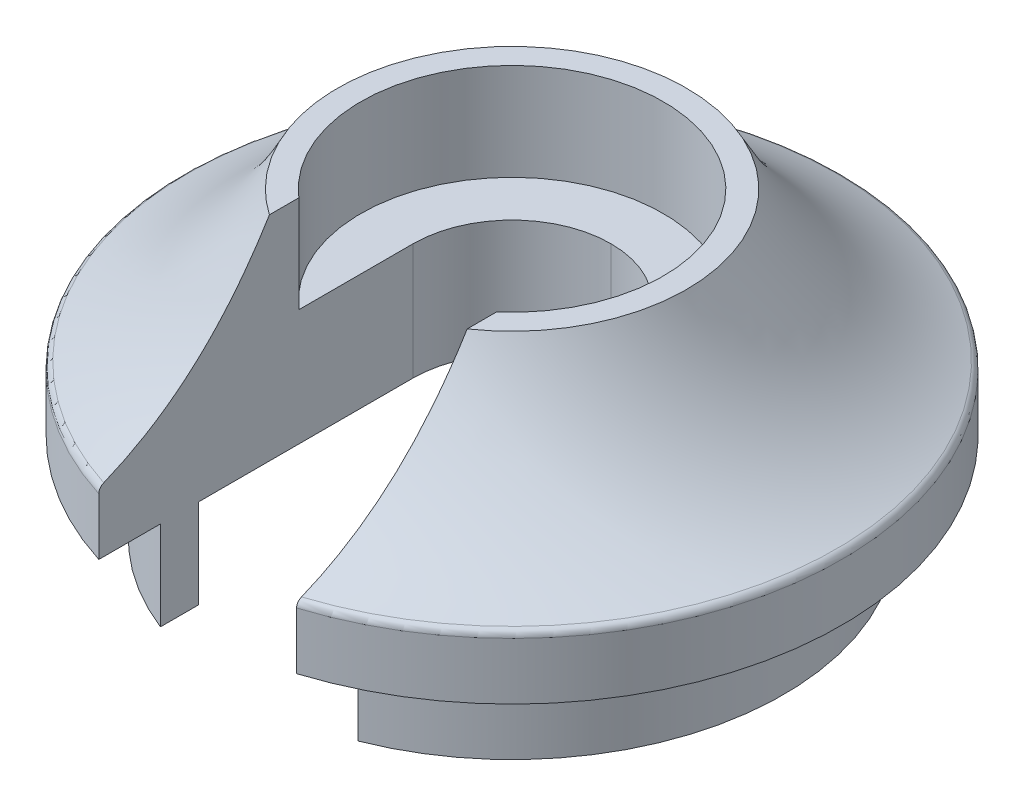
ISO-10303-21;
HEADER;
FILE_DESCRIPTION(('STEP AP214'),'2;1');
FILE_NAME('part.step','',(''),(''),'','','');
FILE_SCHEMA(('AUTOMOTIVE_DESIGN { 1 0 10303 214 1 1 1 1 }'));
ENDSEC;
DATA;
#1=APPLICATION_CONTEXT('core data for automotive mechanical design processes');
#2=APPLICATION_PROTOCOL_DEFINITION('international standard','automotive_design',2000,#1);
#3=PRODUCT_CONTEXT('',#1,'mechanical');
#4=PRODUCT('Part','Part','',(#3));
#5=PRODUCT_RELATED_PRODUCT_CATEGORY('part','',(#4));
#6=PRODUCT_DEFINITION_FORMATION('','',#4);
#7=PRODUCT_DEFINITION_CONTEXT('part definition',#1,'design');
#8=PRODUCT_DEFINITION('design','',#6,#7);
#9=PRODUCT_DEFINITION_SHAPE('','',#8);
#10=(LENGTH_UNIT() NAMED_UNIT(*) SI_UNIT(.MILLI.,.METRE.));
#11=(NAMED_UNIT(*) PLANE_ANGLE_UNIT() SI_UNIT($,.RADIAN.));
#12=(NAMED_UNIT(*) SI_UNIT($,.STERADIAN.) SOLID_ANGLE_UNIT());
#13=UNCERTAINTY_MEASURE_WITH_UNIT(LENGTH_MEASURE(1.E-05),#10,'distance_accuracy_value','');
#14=(GEOMETRIC_REPRESENTATION_CONTEXT(3) GLOBAL_UNCERTAINTY_ASSIGNED_CONTEXT((#13)) GLOBAL_UNIT_ASSIGNED_CONTEXT((#10,
#11,#12)) REPRESENTATION_CONTEXT('',''));
#15=CARTESIAN_POINT('',(0.,0.,0.));
#16=DIRECTION('',(0.,0.,1.));
#17=DIRECTION('',(1.,0.,0.));
#18=AXIS2_PLACEMENT_3D('',#15,#16,#17);
#19=CARTESIAN_POINT('',(-34.347512017,27.232210557,14.670039901));
#20=DIRECTION('',(0.,-1.,0.));
#21=DIRECTION('',(0.,0.,-1.));
#22=AXIS2_PLACEMENT_3D('',#19,#20,#21);
#23=CYLINDRICAL_SURFACE('',#22,7.);
#24=DIRECTION('',(0.,1.,0.));
#25=VECTOR('',#24,1.);
#26=CARTESIAN_POINT('',(-34.347512017,24.932210557,7.670039901));
#27=LINE('',#26,#25);
#28=CARTESIAN_POINT('',(-34.347512017,24.932210557,7.670039901));
#29=VERTEX_POINT('',#28);
#30=CARTESIAN_POINT('',(-34.347512017,27.232210557,7.670039901));
#31=VERTEX_POINT('',#30);
#32=EDGE_CURVE('E185',#29,#31,#27,.T.);
#33=ORIENTED_EDGE('',*,*,#32,.F.);
#34=CARTESIAN_POINT('',(-34.347512017,24.932210557,14.670039901));
#35=DIRECTION('',(0.,1.,0.));
#36=DIRECTION('',(0.,0.,-1.));
#37=AXIS2_PLACEMENT_3D('',#34,#35,#36);
#38=CIRCLE('',#37,7.);
#39=CARTESIAN_POINT('',(-36.897512017,24.932210557,21.189050562));
#40=VERTEX_POINT('',#39);
#41=EDGE_CURVE('E206',#29,#40,#38,.T.);
#42=ORIENTED_EDGE('',*,*,#41,.T.);
#43=DIRECTION('',(0.,-1.,0.));
#44=VECTOR('',#43,1.);
#45=CARTESIAN_POINT('',(-36.897512017,27.232210557,21.189050562));
#46=LINE('',#45,#44);
#47=CARTESIAN_POINT('',(-36.897512017,27.232210557,21.189050562));
#48=VERTEX_POINT('',#47);
#49=EDGE_CURVE('E278',#48,#40,#46,.T.);
#50=ORIENTED_EDGE('',*,*,#49,.F.);
#51=CARTESIAN_POINT('',(-34.347512017,27.232210557,14.670039901));
#52=DIRECTION('',(0.,1.,0.));
#53=DIRECTION('',(0.,0.,-1.));
#54=AXIS2_PLACEMENT_3D('',#51,#52,#53);
#55=CIRCLE('',#54,7.);
#56=EDGE_CURVE('E219',#31,#48,#55,.T.);
#57=ORIENTED_EDGE('',*,*,#56,.F.);
#58=EDGE_LOOP('',(#33,#42,#50,#57));
#59=FACE_BOUND('',#58,.T.);
#60=ADVANCED_FACE('F17',(#59),#23,.T.);
#61=CARTESIAN_POINT('',(-34.347512017,27.232210557,14.670039901));
#62=DIRECTION('',(0.,-1.,0.));
#63=DIRECTION('',(0.,0.,-1.));
#64=AXIS2_PLACEMENT_3D('',#61,#62,#63);
#65=CYLINDRICAL_SURFACE('',#64,6.1);
#66=DIRECTION('',(0.,1.,0.));
#67=VECTOR('',#66,1.);
#68=CARTESIAN_POINT('',(-34.347512017,24.932210557,8.570039901));
#69=LINE('',#68,#67);
#70=CARTESIAN_POINT('',(-34.347512017,24.932210557,8.570039901));
#71=VERTEX_POINT('',#70);
#72=CARTESIAN_POINT('',(-34.347512017,27.232210557,8.570039901));
#73=VERTEX_POINT('',#72);
#74=EDGE_CURVE('E197',#71,#73,#69,.T.);
#75=ORIENTED_EDGE('',*,*,#74,.T.);
#76=CARTESIAN_POINT('',(-34.347512017,27.232210557,14.670039901));
#77=DIRECTION('',(0.,1.,0.));
#78=DIRECTION('',(0.,0.,-1.));
#79=AXIS2_PLACEMENT_3D('',#76,#77,#78);
#80=CIRCLE('',#79,6.1);
#81=CARTESIAN_POINT('',(-36.897512017,27.232210557,20.211474733));
#82=VERTEX_POINT('',#81);
#83=EDGE_CURVE('E174',#73,#82,#80,.T.);
#84=ORIENTED_EDGE('',*,*,#83,.T.);
#85=DIRECTION('',(0.,-1.,0.));
#86=VECTOR('',#85,1.);
#87=CARTESIAN_POINT('',(-36.897512017,27.232210557,20.211474733));
#88=LINE('',#87,#86);
#89=CARTESIAN_POINT('',(-36.897512017,24.932210557,20.211474733));
#90=VERTEX_POINT('',#89);
#91=EDGE_CURVE('E29',#82,#90,#88,.T.);
#92=ORIENTED_EDGE('',*,*,#91,.T.);
#93=CARTESIAN_POINT('',(-34.347512017,24.932210557,14.670039901));
#94=DIRECTION('',(0.,1.,0.));
#95=DIRECTION('',(0.,0.,-1.));
#96=AXIS2_PLACEMENT_3D('',#93,#94,#95);
#97=CIRCLE('',#96,6.1);
#98=EDGE_CURVE('E205',#71,#90,#97,.T.);
#99=ORIENTED_EDGE('',*,*,#98,.F.);
#100=EDGE_LOOP('',(#75,#84,#92,#99));
#101=FACE_BOUND('',#100,.T.);
#102=ADVANCED_FACE('F623',(#101),#65,.F.);
#103=CARTESIAN_POINT('',(-34.347512017,28.832210557,14.670039901));
#104=DIRECTION('',(0.,-1.,0.));
#105=DIRECTION('',(0.,0.,-1.));
#106=AXIS2_PLACEMENT_3D('',#103,#104,#105);
#107=CYLINDRICAL_SURFACE('',#106,8.5);
#108=DIRECTION('',(0.,1.,0.));
#109=VECTOR('',#108,1.);
#110=CARTESIAN_POINT('',(-34.347512017,27.232210557,6.170039901));
#111=LINE('',#110,#109);
#112=CARTESIAN_POINT('',(-34.347512017,27.232210557,6.170039901));
#113=VERTEX_POINT('',#112);
#114=CARTESIAN_POINT('',(-34.347512017,28.698691969,6.170039901));
#115=VERTEX_POINT('',#114);
#116=EDGE_CURVE('E272',#113,#115,#111,.T.);
#117=ORIENTED_EDGE('',*,*,#116,.F.);
#118=CARTESIAN_POINT('',(-34.347512017,27.232210557,14.670039901));
#119=DIRECTION('',(0.,1.,0.));
#120=DIRECTION('',(0.,0.,-1.));
#121=AXIS2_PLACEMENT_3D('',#118,#119,#120);
#122=CIRCLE('',#121,8.5);
#123=CARTESIAN_POINT('',(-36.897512017,27.232210557,22.778523113));
#124=VERTEX_POINT('',#123);
#125=EDGE_CURVE('E246',#113,#124,#122,.T.);
#126=ORIENTED_EDGE('',*,*,#125,.T.);
#127=DIRECTION('',(0.,-1.,0.));
#128=VECTOR('',#127,1.);
#129=CARTESIAN_POINT('',(-36.897512017,28.698691969,22.778523113));
#130=LINE('',#129,#128);
#131=CARTESIAN_POINT('',(-36.897512017,28.698691969,22.778523113));
#132=VERTEX_POINT('',#131);
#133=EDGE_CURVE('E281',#132,#124,#130,.T.);
#134=ORIENTED_EDGE('',*,*,#133,.F.);
#135=CARTESIAN_POINT('',(-34.347512017,28.698691969,14.670039901));
#136=DIRECTION('',(0.,-1.,0.));
#137=DIRECTION('',(0.,0.,-1.));
#138=AXIS2_PLACEMENT_3D('',#135,#136,#137);
#139=CIRCLE('',#138,8.5);
#140=EDGE_CURVE('E11',#132,#115,#139,.T.);
#141=ORIENTED_EDGE('',*,*,#140,.T.);
#142=EDGE_LOOP('',(#117,#126,#134,#141));
#143=FACE_BOUND('',#142,.T.);
#144=ADVANCED_FACE('F318',(#143),#107,.T.);
#145=CARTESIAN_POINT('',(-34.347512017,28.698691969,14.670039901));
#146=DIRECTION('',(0.,-1.,0.));
#147=DIRECTION('',(0.,0.,-1.));
#148=AXIS2_PLACEMENT_3D('',#145,#146,#147);
#149=TOROIDAL_SURFACE('',#148,8.3,0.2);
#150=CARTESIAN_POINT('',(-34.347512017,28.698691969,6.370039901));
#151=DIRECTION('',(1.,0.,0.));
#152=DIRECTION('',(0.,0.,-1.));
#153=AXIS2_PLACEMENT_3D('',#150,#151,#152);
#154=CIRCLE('',#153,0.2);
#155=CARTESIAN_POINT('',(-34.347512017,28.882699288,6.291673413));
#156=VERTEX_POINT('',#155);
#157=EDGE_CURVE('E286',#115,#156,#154,.T.);
#158=ORIENTED_EDGE('',*,*,#157,.F.);
#159=ORIENTED_EDGE('',*,*,#140,.F.);
#160=CARTESIAN_POINT('',(-36.8975120170126,28.698691969,22.7785231130401));
#161=CARTESIAN_POINT('',(-36.8975120243183,28.7008552496042,22.7785231313702));
#162=CARTESIAN_POINT('',(-36.8975136456626,28.703018521631,22.7784858086229));
#163=CARTESIAN_POINT('',(-36.8975195998499,28.7073602329419,22.7783361887411));
#164=CARTESIAN_POINT('',(-36.8975239548208,28.7095386511197,22.7782232792547));
#165=CARTESIAN_POINT('',(-36.8975348868836,28.7139082568021,22.7779209546156));
#166=CARTESIAN_POINT('',(-36.8975414820445,28.716099401029,22.7777309148307));
#167=CARTESIAN_POINT('',(-36.8975564331978,28.7204919604125,22.7772728929467));
#168=CARTESIAN_POINT('',(-36.897564803391,28.7226933092329,22.7770042751972));
#169=CARTESIAN_POINT('',(-36.8975828592834,28.7271036707382,22.7763877265806));
#170=CARTESIAN_POINT('',(-36.8975925554166,28.7293125931124,22.7760391500726));
#171=CARTESIAN_POINT('',(-36.897612839339,28.7337353895451,22.7752613943965));
#172=CARTESIAN_POINT('',(-36.8976234339535,28.7359491484711,22.7748315607547));
#173=CARTESIAN_POINT('',(-36.8976451132444,28.7403788014776,22.7738900860715));
#174=CARTESIAN_POINT('',(-36.8976562013117,28.7425945548027,22.7733777829093));
#175=CARTESIAN_POINT('',(-36.8976784902838,28.7470252776678,22.7722702561139));
#176=CARTESIAN_POINT('',(-36.897689691346,28.7492400800845,22.7716743639512));
#177=CARTESIAN_POINT('',(-36.8977118552509,28.7536658818393,22.7703986437991));
#178=CARTESIAN_POINT('',(-36.8977228152407,28.7558766869981,22.7697181421524));
#179=CARTESIAN_POINT('',(-36.897744174037,28.7602913770648,22.7682722917259));
#180=CARTESIAN_POINT('',(-36.8977545672262,28.7624950401093,22.7675062654844));
#181=CARTESIAN_POINT('',(-36.8977744994777,28.7668922337232,22.7658885649126));
#182=CARTESIAN_POINT('',(-36.8977840304262,28.7690855141798,22.7650362106784));
#183=CARTESIAN_POINT('',(-36.8978019772323,28.7734586385539,22.7632451698496));
#184=CARTESIAN_POINT('',(-36.897810382768,28.7756382036091,22.7623058023074));
#185=CARTESIAN_POINT('',(-36.8978258517411,28.779980504879,22.7603401736008));
#186=CARTESIAN_POINT('',(-36.8978329029569,28.782142933049,22.7593132318768));
#187=CARTESIAN_POINT('',(-36.8978454722322,28.7864474840142,22.7571720228589));
#188=CARTESIAN_POINT('',(-36.8978509764978,28.7885892692191,22.7560570768557));
#189=CARTESIAN_POINT('',(-36.8978602987666,28.7928489779021,22.7537395629072));
#190=CARTESIAN_POINT('',(-36.8978641017491,28.7949665339531,22.7525363195924));
#191=CARTESIAN_POINT('',(-36.8978699083054,28.7991741529934,22.750042056422));
#192=CARTESIAN_POINT('',(-36.897871895994,28.8012638185012,22.7487503660503));
#193=CARTESIAN_POINT('',(-36.8978740007825,28.8054119554004,22.7460792020528));
#194=CARTESIAN_POINT('',(-36.8978741015107,28.8074699991141,22.7446990642988));
#195=CARTESIAN_POINT('',(-36.8978724051642,28.8115511273463,22.7418511527117));
#196=CARTESIAN_POINT('',(-36.8978705916242,28.8135737539268,22.7403827226902));
#197=CARTESIAN_POINT('',(-36.8978650854789,28.8175802249271,22.7373585335015));
#198=CARTESIAN_POINT('',(-36.8978613767209,28.8195635811631,22.7358021276514));
#199=CARTESIAN_POINT('',(-36.8978521467945,28.8234876372025,22.7326024592085));
#200=CARTESIAN_POINT('',(-36.8978466102045,28.8254278186715,22.7309585610147));
#201=CARTESIAN_POINT('',(-36.897833841124,28.8292616066273,22.7275845512847));
#202=CARTESIAN_POINT('',(-36.8978265943728,28.8311546648058,22.7258538168122));
#203=CARTESIAN_POINT('',(-36.8978105732372,28.8348902508313,22.722306954239));
#204=CARTESIAN_POINT('',(-36.8978017861928,28.8367322006555,22.7204902174528));
#205=CARTESIAN_POINT('',(-36.8977829063548,28.8403615857503,22.7167723513575));
#206=CARTESIAN_POINT('',(-36.8977728029503,28.8421484136271,22.7148706291993));
#207=CARTESIAN_POINT('',(-36.8977515677011,28.8456635501101,22.7109839796682));
#208=CARTESIAN_POINT('',(-36.8977404277503,28.8473912223792,22.7089984768631));
#209=CARTESIAN_POINT('',(-36.8977174538897,28.8507840312518,22.7049456440637));
#210=CARTESIAN_POINT('',(-36.8977056148403,28.8524485030877,22.7028777576264));
#211=CARTESIAN_POINT('',(-36.8976816361183,28.8557108923053,22.6986617304967));
#212=CARTESIAN_POINT('',(-36.897669494739,28.8573081170873,22.6965130539101));
#213=CARTESIAN_POINT('',(-36.8976453651355,28.8604320006354,22.6921372181513));
#214=CARTESIAN_POINT('',(-36.8976333791071,28.8619579396532,22.6899095451769));
#215=CARTESIAN_POINT('',(-36.8976100759896,28.8649352577603,22.6853776905211));
#216=CARTESIAN_POINT('',(-36.8975987654709,28.8663858907242,22.6830730186525));
#217=CARTESIAN_POINT('',(-36.8975773923887,28.8692086298839,22.6783893452249));
#218=CARTESIAN_POINT('',(-36.8975673412413,28.8705799644245,22.676009878591));
#219=CARTESIAN_POINT('',(-36.8975491311748,28.8732401821486,22.6711790027513));
#220=CARTESIAN_POINT('',(-36.8975409889937,28.8745282691156,22.6687271550549));
#221=CARTESIAN_POINT('',(-36.8975273048714,28.8770181047028,22.6637541129635));
#222=CARTESIAN_POINT('',(-36.8975217854413,28.8782190334624,22.6612325080889));
#223=CARTESIAN_POINT('',(-36.8975141298704,28.8805307753872,22.6561227633337));
#224=CARTESIAN_POINT('',(-36.8975120225477,28.8816407465585,22.6535342424208));
#225=CARTESIAN_POINT('',(-36.8975120170535,28.8826992884126,22.6509248771674));
#226=B_SPLINE_CURVE_WITH_KNOTS('',3,(#160,#161,#162,#163,#164,#165,#166,#167,#168,#169,#170,
#171,#172,#173,#174,#175,#176,#177,#178,#179,#180,#181,#182,#183,#184,#185,#186,#187,#188,#189,
#190,#191,#192,#193,#194,#195,#196,#197,#198,#199,#200,#201,#202,#203,#204,#205,#206,#207,#208,
#209,#210,#211,#212,#213,#214,#215,#216,#217,#218,#219,#220,#221,#222,#223,#224,#225),
.UNSPECIFIED.,.F.,.F.,(4,2,2,2,2,2,2,2,2,2,2,2,2,2,2,2,2,2,2,2,2,2,2,2,2,2,2,2,2,2,2,2,4),(0.,
0.00648950797088918,0.0130322361460332,0.0196290422169214,0.0262807624212745,0.032988211651047,
0.0397521835740735,0.0465734507686544,0.0534527648705154,0.0603908567316556,0.0673884365907177,
0.0744461942545653,0.0815647992909287,0.0887449012319236,0.0959871297885394,0.103292095076013,
0.110660387850295,0.118092579755754,0.125589223584298,0.133150853546307,0.140777985553535,
0.14847111751446,0.15623072964236,0.164057284776556,0.171951228717179,0.179912990573861,
0.18794298312876,0.196041603214268,0.204209232105729,0.21244623592958,0.22075296608707,
0.229129759693935,0.237576940036127),.UNSPECIFIED.);
#227=CARTESIAN_POINT('',(-36.897512017,28.882699288,22.650924877));
#228=VERTEX_POINT('',#227);
#229=EDGE_CURVE('E263',#132,#228,#226,.T.);
#230=ORIENTED_EDGE('',*,*,#229,.T.);
#231=CARTESIAN_POINT('',(-34.347512017,28.882699288,14.670039901));
#232=DIRECTION('',(0.,1.,0.));
#233=DIRECTION('',(0.,0.,-1.));
#234=AXIS2_PLACEMENT_3D('',#231,#232,#233);
#235=CIRCLE('',#234,8.378366488);
#236=EDGE_CURVE('E454',#156,#228,#235,.T.);
#237=ORIENTED_EDGE('',*,*,#236,.F.);
#238=EDGE_LOOP('',(#158,#159,#230,#237));
#239=FACE_BOUND('',#238,.T.);
#240=ADVANCED_FACE('F307',(#239),#149,.T.);
#241=CARTESIAN_POINT('',(-34.347512017,34.932210557,14.670039901));
#242=DIRECTION('',(0.,-1.,0.));
#243=DIRECTION('',(0.,0.,-1.));
#244=AXIS2_PLACEMENT_3D('',#241,#242,#243);
#245=CYLINDRICAL_SURFACE('',#244,2.55);
#246=DIRECTION('',(0.,1.,0.));
#247=VECTOR('',#246,1.);
#248=CARTESIAN_POINT('',(-34.347512017,27.232210557,12.120039901));
#249=LINE('',#248,#247);
#250=CARTESIAN_POINT('',(-34.347512017,27.232210557,12.120039901));
#251=VERTEX_POINT('',#250);
#252=CARTESIAN_POINT('',(-34.347512017,30.232210557,12.120039901));
#253=VERTEX_POINT('',#252);
#254=EDGE_CURVE('E228',#251,#253,#249,.T.);
#255=ORIENTED_EDGE('',*,*,#254,.T.);
#256=CARTESIAN_POINT('',(-34.347512017,30.232210557,14.670039901));
#257=DIRECTION('',(0.,-1.,0.));
#258=DIRECTION('',(0.,0.,-1.));
#259=AXIS2_PLACEMENT_3D('',#256,#257,#258);
#260=CIRCLE('',#259,2.55);
#261=CARTESIAN_POINT('',(-36.897512017,30.232210557,14.670039901));
#262=VERTEX_POINT('',#261);
#263=EDGE_CURVE('E513',#262,#253,#260,.T.);
#264=ORIENTED_EDGE('',*,*,#263,.F.);
#265=DIRECTION('',(0.,-1.,0.));
#266=VECTOR('',#265,1.);
#267=CARTESIAN_POINT('',(-36.897512017,30.232210557,14.670039901));
#268=LINE('',#267,#266);
#269=CARTESIAN_POINT('',(-36.897512017,27.232210557,14.670039901));
#270=VERTEX_POINT('',#269);
#271=EDGE_CURVE('E261',#262,#270,#268,.T.);
#272=ORIENTED_EDGE('',*,*,#271,.T.);
#273=CARTESIAN_POINT('',(-34.347512017,27.232210557,14.670039901));
#274=DIRECTION('',(0.,-1.,0.));
#275=DIRECTION('',(0.,0.,-1.));
#276=AXIS2_PLACEMENT_3D('',#273,#274,#275);
#277=CIRCLE('',#276,2.55);
#278=EDGE_CURVE('E173',#270,#251,#277,.T.);
#279=ORIENTED_EDGE('',*,*,#278,.T.);
#280=EDGE_LOOP('',(#255,#264,#272,#279));
#281=FACE_BOUND('',#280,.T.);
#282=ADVANCED_FACE('F317',(#281),#245,.F.);
#283=CARTESIAN_POINT('',(-31.797512017,34.932210557,26.007758686));
#284=DIRECTION('',(-1.,0.,0.));
#285=DIRECTION('',(0.,0.,1.));
#286=AXIS2_PLACEMENT_3D('',#283,#284,#285);
#287=PLANE('',#286);
#288=DIRECTION('',(0.,0.,-1.));
#289=VECTOR('',#288,1.);
#290=CARTESIAN_POINT('',(-31.797512017,24.932210557,21.189050562));
#291=LINE('',#290,#289);
#292=CARTESIAN_POINT('',(-31.797512017,24.932210557,21.189050562));
#293=VERTEX_POINT('',#292);
#294=CARTESIAN_POINT('',(-31.797512017,24.932210557,20.211474733));
#295=VERTEX_POINT('',#294);
#296=EDGE_CURVE('E203',#293,#295,#291,.T.);
#297=ORIENTED_EDGE('',*,*,#296,.F.);
#298=DIRECTION('',(0.,1.,0.));
#299=VECTOR('',#298,1.);
#300=CARTESIAN_POINT('',(-31.797512017,24.932210557,21.189050562));
#301=LINE('',#300,#299);
#302=CARTESIAN_POINT('',(-31.797512017,27.232210557,21.189050562));
#303=VERTEX_POINT('',#302);
#304=EDGE_CURVE('E213',#293,#303,#301,.T.);
#305=ORIENTED_EDGE('',*,*,#304,.T.);
#306=DIRECTION('',(0.,0.,1.));
#307=VECTOR('',#306,1.);
#308=CARTESIAN_POINT('',(-31.797512017,27.232210557,21.189050562));
#309=LINE('',#308,#307);
#310=CARTESIAN_POINT('',(-31.797512017,27.232210557,22.778523113));
#311=VERTEX_POINT('',#310);
#312=EDGE_CURVE('E224',#303,#311,#309,.T.);
#313=ORIENTED_EDGE('',*,*,#312,.T.);
#314=DIRECTION('',(0.,1.,0.));
#315=VECTOR('',#314,1.);
#316=CARTESIAN_POINT('',(-31.797512017,27.232210557,22.778523113));
#317=LINE('',#316,#315);
#318=CARTESIAN_POINT('',(-31.797512017,28.698691969,22.778523113));
#319=VERTEX_POINT('',#318);
#320=EDGE_CURVE('E276',#311,#319,#317,.T.);
#321=ORIENTED_EDGE('',*,*,#320,.T.);
#322=CARTESIAN_POINT('',(-31.7975120169465,28.8826992884126,22.6509248771674));
#323=CARTESIAN_POINT('',(-31.7975120114577,28.881640746566,22.653534242404));
#324=CARTESIAN_POINT('',(-31.7975099041403,28.8805307754029,22.6561227633004));
#325=CARTESIAN_POINT('',(-31.7975022485794,28.8782190334954,22.6612325080245));
#326=CARTESIAN_POINT('',(-31.797496729154,28.8770181047448,22.6637541128842));
#327=CARTESIAN_POINT('',(-31.7974830450406,28.8745282691762,22.6687271549478));
#328=CARTESIAN_POINT('',(-31.7974749028636,28.873240182219,22.6711790026311));
#329=CARTESIAN_POINT('',(-31.7974566928049,28.8705799645146,22.6760098784464));
#330=CARTESIAN_POINT('',(-31.7974466416611,28.869208629984,22.678389345069));
#331=CARTESIAN_POINT('',(-31.7974252685856,28.8663858908448,22.6830730184755));
#332=CARTESIAN_POINT('',(-31.7974139580699,28.8649352578912,22.6853776903344));
#333=CARTESIAN_POINT('',(-31.797390654958,28.8619579398049,22.6899095449723));
#334=CARTESIAN_POINT('',(-31.7973786689322,28.8604320007975,22.6921372179387));
#335=CARTESIAN_POINT('',(-31.7973545393333,28.8573081172702,22.6965130536829));
#336=CARTESIAN_POINT('',(-31.797342397956,28.8557108924985,22.698661730263));
#337=CARTESIAN_POINT('',(-31.7973184192376,28.8524485033015,22.7028777573813));
#338=CARTESIAN_POINT('',(-31.7973065801897,28.8507840314757,22.7049456438137));
#339=CARTESIAN_POINT('',(-31.7972836063318,28.847391222623,22.7089984766047));
#340=CARTESIAN_POINT('',(-31.7972724663821,28.8456635503636,22.7109839794063));
#341=CARTESIAN_POINT('',(-31.7972512311346,28.8421484138996,22.7148706289318));
#342=CARTESIAN_POINT('',(-31.7972411277308,28.840361586032,22.716772351088));
#343=CARTESIAN_POINT('',(-31.7972222478936,28.836732200955,22.7204902171804));
#344=CARTESIAN_POINT('',(-31.7972134608494,28.8348902511393,22.7223069539658));
#345=CARTESIAN_POINT('',(-31.7971974397138,28.8311546651303,22.7258538165388));
#346=CARTESIAN_POINT('',(-31.7971901929625,28.8292616069595,22.7275845510116));
#347=CARTESIAN_POINT('',(-31.7971774238813,28.8254278190184,22.7309585607437));
#348=CARTESIAN_POINT('',(-31.7971718872908,28.8234876375563,22.7326024589391));
#349=CARTESIAN_POINT('',(-31.797162657363,28.8195635815297,22.7358021273862));
#350=CARTESIAN_POINT('',(-31.7971589486042,28.8175802252996,22.7373585332389));
#351=CARTESIAN_POINT('',(-31.7971534424569,28.8135737543101,22.7403827224338));
#352=CARTESIAN_POINT('',(-31.7971516289158,28.8115511277344,22.7418511524588));
#353=CARTESIAN_POINT('',(-31.7971499325668,28.8074699995106,22.7446990640538));
#354=CARTESIAN_POINT('',(-31.7971500332936,28.8054119558005,22.7460792018121));
#355=CARTESIAN_POINT('',(-31.7971521380791,28.8012638189074,22.748750365819));
#356=CARTESIAN_POINT('',(-31.7971541257661,28.799174153402,22.7500420561957));
#357=CARTESIAN_POINT('',(-31.797159932319,28.7949665343651,22.7525363193767));
#358=CARTESIAN_POINT('',(-31.7971637352998,28.7928489783152,22.7537395626971));
#359=CARTESIAN_POINT('',(-31.7971730575649,28.788589269633,22.7560570766572));
#360=CARTESIAN_POINT('',(-31.7971785618286,28.7864474844277,22.7571720226664));
#361=CARTESIAN_POINT('',(-31.7971911310999,28.7821429334605,22.7593132316967));
#362=CARTESIAN_POINT('',(-31.7971981823137,28.7799805052888,22.760340173427));
#363=CARTESIAN_POINT('',(-31.7972136512827,28.775638204014,22.7623058021465));
#364=CARTESIAN_POINT('',(-31.7972220568164,28.7734586389556,22.7632451696953));
#365=CARTESIAN_POINT('',(-31.7972400036183,28.7690855145736,22.7650362105372));
#366=CARTESIAN_POINT('',(-31.7972495345647,28.7668922341123,22.7658885647781));
#367=CARTESIAN_POINT('',(-31.7972694668121,28.7624950404876,22.7675062653631));
#368=CARTESIAN_POINT('',(-31.7972798599992,28.7602913774369,22.7682722916111));
#369=CARTESIAN_POINT('',(-31.7973012187914,28.7558766873564,22.7697181420506));
#370=CARTESIAN_POINT('',(-31.7973121787792,28.7536658821899,22.7703986437036));
#371=CARTESIAN_POINT('',(-31.7973343426802,28.7492400804182,22.7716743638682));
#372=CARTESIAN_POINT('',(-31.7973455437404,28.7470252779923,22.772270256037));
#373=CARTESIAN_POINT('',(-31.7973678327089,28.7425945551073,22.773377782844));
#374=CARTESIAN_POINT('',(-31.7973789207744,28.7403788017715,22.7738900860119));
#375=CARTESIAN_POINT('',(-31.7974006000619,28.7359491487421,22.7748315607059));
#376=CARTESIAN_POINT('',(-31.7974111946748,28.7337353898039,22.7752613943528));
#377=CARTESIAN_POINT('',(-31.7974314785942,28.7293125933453,22.7760391500384));
#378=CARTESIAN_POINT('',(-31.797441174726,28.7271036709574,22.7763877265508));
#379=CARTESIAN_POINT('',(-31.7974592306159,28.7226933094234,22.7770042751754));
#380=CARTESIAN_POINT('',(-31.7974676008079,28.7204919605879,22.7772728929286));
#381=CARTESIAN_POINT('',(-31.7974825519593,28.7160994011728,22.7777309148189));
#382=CARTESIAN_POINT('',(-31.7974891471193,28.7139082569294,22.7779209546065));
#383=CARTESIAN_POINT('',(-31.7975000791806,28.7095386512127,22.7782232792501));
#384=CARTESIAN_POINT('',(-31.797504434151,28.7073602330171,22.7783361887382));
#385=CARTESIAN_POINT('',(-31.7975103883376,28.7030185216692,22.7784858086223));
#386=CARTESIAN_POINT('',(-31.7975120096817,28.7008552496233,22.7785231313702));
#387=CARTESIAN_POINT('',(-31.7975120169874,28.698691969,22.7785231130401));
#388=B_SPLINE_CURVE_WITH_KNOTS('',3,(#322,#323,#324,#325,#326,#327,#328,#329,#330,#331,#332,
#333,#334,#335,#336,#337,#338,#339,#340,#341,#342,#343,#344,#345,#346,#347,#348,#349,#350,#351,
#352,#353,#354,#355,#356,#357,#358,#359,#360,#361,#362,#363,#364,#365,#366,#367,#368,#369,#370,
#371,#372,#373,#374,#375,#376,#377,#378,#379,#380,#381,#382,#383,#384,#385,#386,#387),
.UNSPECIFIED.,.F.,.F.,(4,2,2,2,2,2,2,2,2,2,2,2,2,2,2,2,2,2,2,2,2,2,2,2,2,2,2,2,2,2,2,2,4),(0.,
0.00844718028711081,0.0168239738423524,0.0251307039516791,0.0333677077308474,0.0415353365811237,
0.0496339566289592,0.0576639491497092,0.0656257109757813,0.0735196548893422,0.0813462100000464,
0.0891058221080296,0.0967989540526296,0.104426086047144,0.111987716000052,0.11948435982313,
0.126916551726755,0.134284844502859,0.141589809795817,0.148832038361585,0.156012140315418,
0.163130745368303,0.170188503052376,0.177186082935362,0.184124174824135,0.191003488957338,
0.197824756186982,0.204588728148789,0.211296177421065,0.217947897671635,0.22454470379246,
0.231087432021252,0.237576940049499),.UNSPECIFIED.);
#389=CARTESIAN_POINT('',(-31.797512017,28.882699288,22.650924877));
#390=VERTEX_POINT('',#389);
#391=EDGE_CURVE('E345',#390,#319,#388,.T.);
#392=ORIENTED_EDGE('',*,*,#391,.F.);
#393=CARTESIAN_POINT('',(-31.797512017103,32.7322105569088,18.3778020288503));
#394=CARTESIAN_POINT('',(-31.7975115423342,32.62300743707,18.4443533063185));
#395=CARTESIAN_POINT('',(-31.7975005762817,32.5147383350231,18.5124531046203));
#396=CARTESIAN_POINT('',(-31.7974698827554,32.3018780374826,18.6508785456908));
#397=CARTESIAN_POINT('',(-31.7974502856187,32.197256218492,18.721157136518));
#398=CARTESIAN_POINT('',(-31.7974140957782,31.9917374174836,18.8640037924977));
#399=CARTESIAN_POINT('',(-31.797397465027,31.8908088503378,18.9365263308001));
#400=CARTESIAN_POINT('',(-31.7973741286349,31.6927289814922,19.083917617074));
#401=CARTESIAN_POINT('',(-31.7973672955139,31.5955454804487,19.1587430429909));
#402=CARTESIAN_POINT('',(-31.7973662977123,31.4050064489663,19.310793626247));
#403=CARTESIAN_POINT('',(-31.7973719793206,31.3116186619406,19.3879783113644));
#404=CARTESIAN_POINT('',(-31.7973939671645,31.1287217718154,19.544797181555));
#405=CARTESIAN_POINT('',(-31.7974101540597,31.0391810033346,19.6243943932197));
#406=CARTESIAN_POINT('',(-31.7974467508233,30.8640283537912,19.7860851235996));
#407=CARTESIAN_POINT('',(-31.7974671169101,30.7783861693829,19.868145779608));
#408=CARTESIAN_POINT('',(-31.7974990965322,30.6110800672184,20.0348067820528));
#409=CARTESIAN_POINT('',(-31.7975107844311,30.5293880925976,20.1193789363201));
#410=CARTESIAN_POINT('',(-31.7975132646351,30.3684740208003,20.2927849911648));
#411=CARTESIAN_POINT('',(-31.7975037990399,30.2892944755504,20.3816584251495));
#412=CARTESIAN_POINT('',(-31.7974793907174,30.1345437022595,20.5628877900854));
#413=CARTESIAN_POINT('',(-31.7974644341099,30.0589821718685,20.655252009591));
#414=CARTESIAN_POINT('',(-31.797436297006,29.9116291529153,20.8435763279191));
#415=CARTESIAN_POINT('',(-31.797423124322,29.8398550375973,20.939550031812));
#416=CARTESIAN_POINT('',(-31.7974043868914,29.70023945765,21.1352062071232));
#417=CARTESIAN_POINT('',(-31.797398869174,29.6324247337728,21.2349077734874));
#418=CARTESIAN_POINT('',(-31.7973975672493,29.5008910556774,21.438132164216));
#419=CARTESIAN_POINT('',(-31.7974018626362,29.4372099331905,21.5416794869232));
#420=CARTESIAN_POINT('',(-31.7974188013093,29.3141059451905,21.7527075934422));
#421=CARTESIAN_POINT('',(-31.7974315300733,29.254733661966,21.8602178956744));
#422=CARTESIAN_POINT('',(-31.7974603284935,29.1404141855758,22.0792858415137));
#423=CARTESIAN_POINT('',(-31.7974764380799,29.0855318916248,22.190877349089));
#424=CARTESIAN_POINT('',(-31.7975020284403,28.9803449902742,22.4182178046244));
#425=CARTESIAN_POINT('',(-31.797511406991,28.9301206676407,22.5340039096273));
#426=CARTESIAN_POINT('',(-31.797512017,28.882699288,22.650924877));
#427=B_SPLINE_CURVE_WITH_KNOTS('',3,(#393,#394,#395,#396,#397,#398,#399,#400,#401,#402,#403,
#404,#405,#406,#407,#408,#409,#410,#411,#412,#413,#414,#415,#416,#417,#418,#419,#420,#421,#422,
#423,#424,#425,#426),.UNSPECIFIED.,.F.,.F.,(4,2,2,2,2,2,2,2,2,2,2,2,2,2,2,2,4),(0.,
0.383652242877186,0.761699662407643,1.13448112431148,1.5023667676214,1.86575911564889,
2.22509391704115,2.58084065307045,2.93350264801932,3.29048767226503,3.6483813688915,
4.00779495669632,4.36940701065594,4.73396250257699,5.10227071103791,5.47520200012749,
5.85368353111907),.UNSPECIFIED.);
#428=CARTESIAN_POINT('',(-31.797512017,32.732210557,18.377802029));
#429=VERTEX_POINT('',#428);
#430=EDGE_CURVE('E223',#429,#390,#427,.T.);
#431=ORIENTED_EDGE('',*,*,#430,.F.);
#432=DIRECTION('',(0.,0.,1.));
#433=VECTOR('',#432,1.);
#434=CARTESIAN_POINT('',(-31.797512017,32.732210557,17.620887237));
#435=LINE('',#434,#433);
#436=CARTESIAN_POINT('',(-31.797512017,32.732210557,17.620887237));
#437=VERTEX_POINT('',#436);
#438=EDGE_CURVE('E264',#437,#429,#435,.T.);
#439=ORIENTED_EDGE('',*,*,#438,.F.);
#440=DIRECTION('',(0.,-1.,0.));
#441=VECTOR('',#440,1.);
#442=CARTESIAN_POINT('',(-31.797512017,32.732210557,17.620887237));
#443=LINE('',#442,#441);
#444=CARTESIAN_POINT('',(-31.797512017,30.232210557,17.620887237));
#445=VERTEX_POINT('',#444);
#446=EDGE_CURVE('E259',#437,#445,#443,.T.);
#447=ORIENTED_EDGE('',*,*,#446,.T.);
#448=DIRECTION('',(0.,0.,1.));
#449=VECTOR('',#448,1.);
#450=CARTESIAN_POINT('',(-31.797512017,30.232210557,14.670039901));
#451=LINE('',#450,#449);
#452=CARTESIAN_POINT('',(-31.797512017,30.232210557,14.670039901));
#453=VERTEX_POINT('',#452);
#454=EDGE_CURVE('E201',#453,#445,#451,.T.);
#455=ORIENTED_EDGE('',*,*,#454,.F.);
#456=DIRECTION('',(0.,-1.,0.));
#457=VECTOR('',#456,1.);
#458=CARTESIAN_POINT('',(-31.797512017,30.232210557,14.670039901));
#459=LINE('',#458,#457);
#460=CARTESIAN_POINT('',(-31.797512017,27.232210557,14.670039901));
#461=VERTEX_POINT('',#460);
#462=EDGE_CURVE('E168',#453,#461,#459,.T.);
#463=ORIENTED_EDGE('',*,*,#462,.T.);
#464=DIRECTION('',(0.,0.,1.));
#465=VECTOR('',#464,1.);
#466=CARTESIAN_POINT('',(-31.797512017,27.232210557,14.670039901));
#467=LINE('',#466,#465);
#468=CARTESIAN_POINT('',(-31.797512017,27.232210557,20.211474733));
#469=VERTEX_POINT('',#468);
#470=EDGE_CURVE('E161',#461,#469,#467,.T.);
#471=ORIENTED_EDGE('',*,*,#470,.T.);
#472=DIRECTION('',(0.,1.,0.));
#473=VECTOR('',#472,1.);
#474=CARTESIAN_POINT('',(-31.797512017,24.932210557,20.211474733));
#475=LINE('',#474,#473);
#476=EDGE_CURVE('E165',#295,#469,#475,.T.);
#477=ORIENTED_EDGE('',*,*,#476,.F.);
#478=EDGE_LOOP('',(#297,#305,#313,#321,#392,#431,#439,#447,#455,#463,#471,#477));
#479=FACE_BOUND('',#478,.T.);
#480=ADVANCED_FACE('F163',(#479),#287,.T.);
#481=CARTESIAN_POINT('',(-36.897512017,34.932210557,14.670039901));
#482=DIRECTION('',(1.,0.,0.));
#483=DIRECTION('',(0.,1.,0.));
#484=AXIS2_PLACEMENT_3D('',#481,#482,#483);
#485=PLANE('',#484);
#486=DIRECTION('',(0.,0.,-1.));
#487=VECTOR('',#486,1.);
#488=CARTESIAN_POINT('',(-36.897512017,27.232210557,20.211474733));
#489=LINE('',#488,#487);
#490=EDGE_CURVE('E237',#82,#270,#489,.T.);
#491=ORIENTED_EDGE('',*,*,#490,.T.);
#492=ORIENTED_EDGE('',*,*,#271,.F.);
#493=DIRECTION('',(0.,0.,-1.));
#494=VECTOR('',#493,1.);
#495=CARTESIAN_POINT('',(-36.897512017,30.232210557,17.620887237));
#496=LINE('',#495,#494);
#497=CARTESIAN_POINT('',(-36.897512017,30.232210557,17.620887237));
#498=VERTEX_POINT('',#497);
#499=EDGE_CURVE('E254',#498,#262,#496,.T.);
#500=ORIENTED_EDGE('',*,*,#499,.F.);
#501=DIRECTION('',(0.,1.,0.));
#502=VECTOR('',#501,1.);
#503=CARTESIAN_POINT('',(-36.897512017,30.232210557,17.620887237));
#504=LINE('',#503,#502);
#505=CARTESIAN_POINT('',(-36.897512017,32.732210557,17.620887237));
#506=VERTEX_POINT('',#505);
#507=EDGE_CURVE('E256',#498,#506,#504,.T.);
#508=ORIENTED_EDGE('',*,*,#507,.T.);
#509=DIRECTION('',(0.,0.,-1.));
#510=VECTOR('',#509,1.);
#511=CARTESIAN_POINT('',(-36.897512017,32.732210557,18.377802029));
#512=LINE('',#511,#510);
#513=CARTESIAN_POINT('',(-36.897512017,32.732210557,18.377802029));
#514=VERTEX_POINT('',#513);
#515=EDGE_CURVE('E298',#514,#506,#512,.T.);
#516=ORIENTED_EDGE('',*,*,#515,.F.);
#517=CARTESIAN_POINT('',(-36.897512017,28.882699288,22.650924877));
#518=CARTESIAN_POINT('',(-36.8975126267169,28.9301133533295,22.5340219579692));
#519=CARTESIAN_POINT('',(-36.8975220516871,28.9803294841558,22.4182535460264));
#520=CARTESIAN_POINT('',(-36.8975477926508,29.0854989398542,22.1909462948221));
#521=CARTESIAN_POINT('',(-36.8975640056324,29.1403720564725,22.0793703346682));
#522=CARTESIAN_POINT('',(-36.8975930332602,29.2546723211184,21.8603314296065));
#523=CARTESIAN_POINT('',(-36.8976058875156,29.3140346350017,21.7528346558904));
#524=CARTESIAN_POINT('',(-36.8976230637836,29.4371180367107,21.5418316832759));
#525=CARTESIAN_POINT('',(-36.8976274713268,29.5007885971929,21.43829599945));
#526=CARTESIAN_POINT('',(-36.8976263472594,29.6323007045106,21.2350930921165));
#527=CARTESIAN_POINT('',(-36.8976208955302,29.7001044662075,21.1354014018737));
#528=CARTESIAN_POINT('',(-36.8976022059523,29.8396978719611,20.9397633136073));
#529=CARTESIAN_POINT('',(-36.8975890155796,29.9114608151731,20.8437978504069));
#530=CARTESIAN_POINT('',(-36.8975607444683,30.0587914265009,20.6554884710767));
#531=CARTESIAN_POINT('',(-36.897545671944,30.1343417561847,20.5631309781348));
#532=CARTESIAN_POINT('',(-36.8975208405787,30.2890702626242,20.3819136632643));
#533=CARTESIAN_POINT('',(-36.8975110683847,30.3682387727553,20.2930455799374));
#534=CARTESIAN_POINT('',(-36.8975129544559,30.529145642606,20.1196332324171));
#535=CARTESIAN_POINT('',(-36.8975243585953,30.6108421076478,20.0350500486657));
#536=CARTESIAN_POINT('',(-36.8975559679524,30.7781586523333,19.868366854573));
#537=CARTESIAN_POINT('',(-36.8975762493448,30.8638068198387,19.7862950655745));
#538=CARTESIAN_POINT('',(-36.8976127661551,31.0389729891593,19.6245819900986));
#539=CARTESIAN_POINT('',(-36.8976289586667,31.128521326356,19.5449735990573));
#540=CARTESIAN_POINT('',(-36.8976510236987,31.3114349798529,19.3881323280779));
#541=CARTESIAN_POINT('',(-36.897656777533,31.4048319940043,19.3109364575757));
#542=CARTESIAN_POINT('',(-36.897655950967,31.5953911829791,19.1588635011989));
#543=CARTESIAN_POINT('',(-36.8976492170652,31.6925856469335,19.0840269267104));
#544=CARTESIAN_POINT('',(-36.8976260784336,31.890689220661,18.9366133776512));
#545=CARTESIAN_POINT('',(-36.8976095461088,31.9916305619965,18.8640797671314));
#546=CARTESIAN_POINT('',(-36.897573528807,32.1971767655737,18.7212110363269));
#547=CARTESIAN_POINT('',(-36.8975540053954,32.3018132444677,18.6509214873825));
#548=CARTESIAN_POINT('',(-36.8975234194106,32.5147047937776,18.5124742309666));
#549=CARTESIAN_POINT('',(-36.897512486658,32.6229905183171,18.4443636219733));
#550=CARTESIAN_POINT('',(-36.8975120170415,32.732210557,18.3778020290603));
#551=B_SPLINE_CURVE_WITH_KNOTS('',3,(#517,#518,#519,#520,#521,#522,#523,#524,#525,#526,#527,
#528,#529,#530,#531,#532,#533,#534,#535,#536,#537,#538,#539,#540,#541,#542,#543,#544,#545,#546,
#547,#548,#549,#550),.UNSPECIFIED.,.F.,.F.,(4,2,2,2,2,2,2,2,2,2,2,2,2,2,2,2,4),(0.,
0.37842312516335,0.751300471270088,1.11955874932002,1.48406794870561,1.8456370496045,
2.20501080082806,2.56286762736437,2.91981866731295,3.27251378564667,3.62829655903804,
3.9876705815106,4.35110561351971,4.71903769022732,5.09186962691019,5.46997185837814,
5.85368354854408),.UNSPECIFIED.);
#552=EDGE_CURVE('E429',#228,#514,#551,.T.);
#553=ORIENTED_EDGE('',*,*,#552,.F.);
#554=ORIENTED_EDGE('',*,*,#229,.F.);
#555=ORIENTED_EDGE('',*,*,#133,.T.);
#556=DIRECTION('',(0.,0.,-1.));
#557=VECTOR('',#556,1.);
#558=CARTESIAN_POINT('',(-36.897512017,27.232210557,22.778523113));
#559=LINE('',#558,#557);
#560=EDGE_CURVE('E209',#124,#48,#559,.T.);
#561=ORIENTED_EDGE('',*,*,#560,.T.);
#562=ORIENTED_EDGE('',*,*,#49,.T.);
#563=DIRECTION('',(0.,0.,1.));
#564=VECTOR('',#563,1.);
#565=CARTESIAN_POINT('',(-36.897512017,24.932210557,20.211474733));
#566=LINE('',#565,#564);
#567=EDGE_CURVE('E236',#90,#40,#566,.T.);
#568=ORIENTED_EDGE('',*,*,#567,.F.);
#569=ORIENTED_EDGE('',*,*,#91,.F.);
#570=EDGE_LOOP('',(#491,#492,#500,#508,#516,#553,#554,#555,#561,#562,#568,#569));
#571=FACE_BOUND('',#570,.T.);
#572=ADVANCED_FACE('F19',(#571),#485,.T.);
#573=CARTESIAN_POINT('',(-34.347512017,32.732210557,14.670039901));
#574=DIRECTION('',(0.,1.,0.));
#575=DIRECTION('',(1.,0.,0.));
#576=AXIS2_PLACEMENT_3D('',#573,#574,#575);
#577=PLANE('',#576);
#578=CARTESIAN_POINT('',(-31.797512017,32.732210557,18.377802029));
#579=CARTESIAN_POINT('',(-29.066862279,32.732210557,16.499807543));
#580=CARTESIAN_POINT('',(-30.05013319,32.732210557,13.334923722));
#581=CARTESIAN_POINT('',(-31.033404101,32.732210557,10.170039901));
#582=CARTESIAN_POINT('',(-34.347512017,32.732210557,10.170039901));
#583=CARTESIAN_POINT('',(-37.661619934,32.732210557,10.170039901));
#584=CARTESIAN_POINT('',(-38.644890845,32.732210557,13.334923722));
#585=CARTESIAN_POINT('',(-39.628161756,32.732210557,16.499807543));
#586=CARTESIAN_POINT('',(-36.897512017,32.732210557,18.377802029));
#587=(BOUNDED_CURVE() B_SPLINE_CURVE(2,(#578,#579,#580,#581,#582,#583,#584,#585,#586),
.UNSPECIFIED.,.F.,.F.) B_SPLINE_CURVE_WITH_KNOTS((3,2,2,2,3),(34.518107841,107.259053921,180.,
252.740946079,325.481892159),
.UNSPECIFIED.) CURVE() GEOMETRIC_REPRESENTATION_ITEM() RATIONAL_B_SPLINE_CURVE((1.,0.805199505,
1.,0.805199505,1.,0.805199505,1.,0.805199505,1.)) REPRESENTATION_ITEM(''));
#588=EDGE_CURVE('E255',#429,#514,#587,.T.);
#589=ORIENTED_EDGE('',*,*,#588,.T.);
#590=ORIENTED_EDGE('',*,*,#515,.T.);
#591=CARTESIAN_POINT('',(-34.347512017,32.732210557,14.670039901));
#592=DIRECTION('',(0.,1.,0.));
#593=DIRECTION('',(0.,0.,1.));
#594=AXIS2_PLACEMENT_3D('',#591,#592,#593);
#595=CIRCLE('',#594,3.9);
#596=EDGE_CURVE('E294',#437,#506,#595,.T.);
#597=ORIENTED_EDGE('',*,*,#596,.F.);
#598=ORIENTED_EDGE('',*,*,#438,.T.);
#599=EDGE_LOOP('',(#589,#590,#597,#598));
#600=FACE_BOUND('',#599,.T.);
#601=ADVANCED_FACE('F614',(#600),#577,.T.);
#602=CARTESIAN_POINT('',(-34.347512017,30.232210557,14.670039901));
#603=DIRECTION('',(0.,1.,0.));
#604=DIRECTION('',(0.,0.,1.));
#605=AXIS2_PLACEMENT_3D('',#602,#603,#604);
#606=CYLINDRICAL_SURFACE('',#605,3.9);
#607=ORIENTED_EDGE('',*,*,#507,.F.);
#608=CARTESIAN_POINT('',(-34.347512017,30.232210557,14.670039901));
#609=DIRECTION('',(0.,1.,0.));
#610=DIRECTION('',(0.,0.,1.));
#611=AXIS2_PLACEMENT_3D('',#608,#609,#610);
#612=CIRCLE('',#611,3.9);
#613=EDGE_CURVE('E250',#445,#498,#612,.T.);
#614=ORIENTED_EDGE('',*,*,#613,.F.);
#615=ORIENTED_EDGE('',*,*,#446,.F.);
#616=ORIENTED_EDGE('',*,*,#596,.T.);
#617=EDGE_LOOP('',(#607,#614,#615,#616));
#618=FACE_BOUND('',#617,.T.);
#619=ADVANCED_FACE('F620',(#618),#606,.F.);
#620=CARTESIAN_POINT('',(-34.347512017,30.232210557,14.670039901));
#621=DIRECTION('',(0.,1.,0.));
#622=DIRECTION('',(1.,0.,0.));
#623=AXIS2_PLACEMENT_3D('',#620,#621,#622);
#624=PLANE('',#623);
#625=ORIENTED_EDGE('',*,*,#613,.T.);
#626=ORIENTED_EDGE('',*,*,#499,.T.);
#627=ORIENTED_EDGE('',*,*,#263,.T.);
#628=CARTESIAN_POINT('',(-34.347512017,30.232210557,14.670039901));
#629=DIRECTION('',(0.,-1.,0.));
#630=DIRECTION('',(0.,0.,-1.));
#631=AXIS2_PLACEMENT_3D('',#628,#629,#630);
#632=CIRCLE('',#631,2.55);
#633=EDGE_CURVE('E282',#253,#453,#632,.T.);
#634=ORIENTED_EDGE('',*,*,#633,.T.);
#635=ORIENTED_EDGE('',*,*,#454,.T.);
#636=EDGE_LOOP('',(#625,#626,#627,#634,#635));
#637=FACE_BOUND('',#636,.T.);
#638=ADVANCED_FACE('F408',(#637),#624,.T.);
#639=CARTESIAN_POINT('',(-32.9779133,32.732210557,18.95655356));
#640=CARTESIAN_POINT('',(-26.429648015,32.732210557,16.864294804));
#641=CARTESIAN_POINT('',(-27.624371269,32.732210557,10.170039901));
#642=CARTESIAN_POINT('',(-34.347512017,32.732210557,10.170039901));
#643=CARTESIAN_POINT('',(-34.347529921,32.732210557,10.170039901));
#644=CARTESIAN_POINT('',(-34.347547824,32.732210557,10.170039901));
#645=CARTESIAN_POINT('',(-34.347565727,32.732210557,10.170039901));
#646=CARTESIAN_POINT('',(-41.070667087,32.732210557,10.170120145));
#647=CARTESIAN_POINT('',(-42.265284298,32.732210557,16.86432411));
#648=CARTESIAN_POINT('',(-35.717110735,32.732210557,18.95655356));
#649=CARTESIAN_POINT('',(-32.550671447,29.936604074,20.293717514));
#650=CARTESIAN_POINT('',(-23.959696167,29.936604074,17.548785463));
#651=CARTESIAN_POINT('',(-25.527109443,29.936604074,8.76627958));
#652=CARTESIAN_POINT('',(-34.347512017,29.936604074,8.76627958));
#653=CARTESIAN_POINT('',(-34.347535506,29.936604074,8.76627958));
#654=CARTESIAN_POINT('',(-34.347558994,29.936604074,8.76627958));
#655=CARTESIAN_POINT('',(-34.347582482,29.936604074,8.76627958));
#656=CARTESIAN_POINT('',(-43.16793338,29.936604074,8.766384856));
#657=CARTESIAN_POINT('',(-44.735207534,29.936604074,17.548823912));
#658=CARTESIAN_POINT('',(-36.144352588,29.936604074,20.293717514));
#659=CARTESIAN_POINT('',(-31.797512017,28.882699288,22.650924877));
#660=CARTESIAN_POINT('',(-19.605563925,28.882699288,18.755433622));
#661=CARTESIAN_POINT('',(-21.82997043,28.882699288,6.291673413));
#662=CARTESIAN_POINT('',(-34.347512017,28.882699288,6.291673413));
#663=CARTESIAN_POINT('',(-34.347545351,28.882699288,6.291673413));
#664=CARTESIAN_POINT('',(-34.347578684,28.882699288,6.291673413));
#665=CARTESIAN_POINT('',(-34.347612018,28.882699288,6.291673414));
#666=CARTESIAN_POINT('',(-46.865080268,28.882699288,6.29182281699999));
#667=CARTESIAN_POINT('',(-49.089289336,28.882699288,18.755488186));
#668=CARTESIAN_POINT('',(-36.897512017,28.882699288,22.650924877));
#669=(BOUNDED_SURFACE() B_SPLINE_SURFACE(2,3,((#639,#640,#641,#642,#643,#644,#645,#646,#647,
#648),(#649,#650,#651,#652,#653,#654,#655,#656,#657,#658),(#659,#660,#661,#662,#663,#664,#665,
#666,#667,#668)),.UNSPECIFIED.,.F.,.F.,.F.) B_SPLINE_SURFACE_WITH_KNOTS((3,3),(4,3,3,4),(0.,
0.853327572),(0.008453794,0.5,0.500003012,0.991546206),
.UNSPECIFIED.) GEOMETRIC_REPRESENTATION_ITEM() RATIONAL_B_SPLINE_SURFACE(((0.971317643,
0.424966177,0.434526962,1.,0.999996535,0.999993069,0.999989604,0.434526845,0.424969525,
0.971317643),(0.971317643,0.424966177,0.434526962,1.,0.999996535,0.999993069,0.999989604,
0.434526845,0.424969525,0.971317643),(0.971317643,0.424966177,0.434526962,1.,0.999996535,
0.999993069,0.999989604,0.434526845,0.424969525,0.971317643))) REPRESENTATION_ITEM('') SURFACE());
#670=CARTESIAN_POINT('',(-34.347512017,28.882699288,14.670039901));
#671=DIRECTION('',(0.,1.,0.));
#672=DIRECTION('',(0.,0.,-1.));
#673=AXIS2_PLACEMENT_3D('',#670,#671,#672);
#674=CIRCLE('',#673,8.378366488);
#675=EDGE_CURVE('E367',#390,#156,#674,.T.);
#676=ORIENTED_EDGE('',*,*,#430,.T.);
#677=ORIENTED_EDGE('',*,*,#675,.T.);
#678=ORIENTED_EDGE('',*,*,#236,.T.);
#679=ORIENTED_EDGE('',*,*,#552,.T.);
#680=ORIENTED_EDGE('',*,*,#588,.F.);
#681=EDGE_LOOP('',(#676,#677,#678,#679,#680));
#682=FACE_BOUND('',#681,.T.);
#683=ADVANCED_FACE('F397',(#682),#669,.T.);
#684=CARTESIAN_POINT('',(-34.347512017,27.232210557,14.670039901));
#685=DIRECTION('',(0.,1.,0.));
#686=DIRECTION('',(1.,0.,0.));
#687=AXIS2_PLACEMENT_3D('',#684,#685,#686);
#688=PLANE('',#687);
#689=ORIENTED_EDGE('',*,*,#560,.F.);
#690=ORIENTED_EDGE('',*,*,#125,.F.);
#691=CARTESIAN_POINT('',(-34.347512017,27.232210557,14.670039901));
#692=DIRECTION('',(0.,1.,0.));
#693=DIRECTION('',(0.,0.,-1.));
#694=AXIS2_PLACEMENT_3D('',#691,#692,#693);
#695=CIRCLE('',#694,8.5);
#696=EDGE_CURVE('E212',#311,#113,#695,.T.);
#697=ORIENTED_EDGE('',*,*,#696,.F.);
#698=ORIENTED_EDGE('',*,*,#312,.F.);
#699=CARTESIAN_POINT('',(-34.347512017,27.232210557,14.670039901));
#700=DIRECTION('',(0.,1.,0.));
#701=DIRECTION('',(0.,0.,-1.));
#702=AXIS2_PLACEMENT_3D('',#699,#700,#701);
#703=CIRCLE('',#702,7.);
#704=EDGE_CURVE('E218',#303,#31,#703,.T.);
#705=ORIENTED_EDGE('',*,*,#704,.T.);
#706=ORIENTED_EDGE('',*,*,#56,.T.);
#707=EDGE_LOOP('',(#689,#690,#697,#698,#705,#706));
#708=FACE_BOUND('',#707,.T.);
#709=ADVANCED_FACE('F328',(#708),#688,.F.);
#710=CARTESIAN_POINT('',(-34.347512017,27.232210557,14.670039901));
#711=DIRECTION('',(0.,1.,0.));
#712=DIRECTION('',(1.,0.,0.));
#713=AXIS2_PLACEMENT_3D('',#710,#711,#712);
#714=PLANE('',#713);
#715=ORIENTED_EDGE('',*,*,#490,.F.);
#716=ORIENTED_EDGE('',*,*,#83,.F.);
#717=CARTESIAN_POINT('',(-34.347512017,27.232210557,14.670039901));
#718=DIRECTION('',(0.,1.,0.));
#719=DIRECTION('',(0.,0.,-1.));
#720=AXIS2_PLACEMENT_3D('',#717,#718,#719);
#721=CIRCLE('',#720,6.1);
#722=EDGE_CURVE('E177',#469,#73,#721,.T.);
#723=ORIENTED_EDGE('',*,*,#722,.F.);
#724=ORIENTED_EDGE('',*,*,#470,.F.);
#725=CARTESIAN_POINT('',(-34.347512017,27.232210557,14.670039901));
#726=DIRECTION('',(0.,-1.,0.));
#727=DIRECTION('',(0.,0.,-1.));
#728=AXIS2_PLACEMENT_3D('',#725,#726,#727);
#729=CIRCLE('',#728,2.55);
#730=EDGE_CURVE('E232',#251,#461,#729,.T.);
#731=ORIENTED_EDGE('',*,*,#730,.F.);
#732=ORIENTED_EDGE('',*,*,#278,.F.);
#733=EDGE_LOOP('',(#715,#716,#723,#724,#731,#732));
#734=FACE_BOUND('',#733,.T.);
#735=ADVANCED_FACE('F179',(#734),#714,.F.);
#736=CARTESIAN_POINT('',(-34.347512017,24.932210557,14.670039901));
#737=DIRECTION('',(0.,1.,0.));
#738=DIRECTION('',(1.,0.,0.));
#739=AXIS2_PLACEMENT_3D('',#736,#737,#738);
#740=PLANE('',#739);
#741=ORIENTED_EDGE('',*,*,#567,.T.);
#742=ORIENTED_EDGE('',*,*,#41,.F.);
#743=CARTESIAN_POINT('',(-34.347512017,24.932210557,14.670039901));
#744=DIRECTION('',(0.,1.,0.));
#745=DIRECTION('',(0.,0.,-1.));
#746=AXIS2_PLACEMENT_3D('',#743,#744,#745);
#747=CIRCLE('',#746,7.);
#748=EDGE_CURVE('E217',#293,#29,#747,.T.);
#749=ORIENTED_EDGE('',*,*,#748,.F.);
#750=ORIENTED_EDGE('',*,*,#296,.T.);
#751=CARTESIAN_POINT('',(-34.347512017,24.932210557,14.670039901));
#752=DIRECTION('',(0.,1.,0.));
#753=DIRECTION('',(0.,0.,-1.));
#754=AXIS2_PLACEMENT_3D('',#751,#752,#753);
#755=CIRCLE('',#754,6.1);
#756=EDGE_CURVE('E189',#295,#71,#755,.T.);
#757=ORIENTED_EDGE('',*,*,#756,.T.);
#758=ORIENTED_EDGE('',*,*,#98,.T.);
#759=EDGE_LOOP('',(#741,#742,#749,#750,#757,#758));
#760=FACE_BOUND('',#759,.T.);
#761=ADVANCED_FACE('F636',(#760),#740,.F.);
#762=CARTESIAN_POINT('',(-34.347512017,27.232210557,14.670039901));
#763=DIRECTION('',(0.,-1.,0.));
#764=DIRECTION('',(0.,0.,-1.));
#765=AXIS2_PLACEMENT_3D('',#762,#763,#764);
#766=CYLINDRICAL_SURFACE('',#765,7.);
#767=ORIENTED_EDGE('',*,*,#32,.T.);
#768=ORIENTED_EDGE('',*,*,#704,.F.);
#769=ORIENTED_EDGE('',*,*,#304,.F.);
#770=ORIENTED_EDGE('',*,*,#748,.T.);
#771=EDGE_LOOP('',(#767,#768,#769,#770));
#772=FACE_BOUND('',#771,.T.);
#773=ADVANCED_FACE('F633',(#772),#766,.T.);
#774=CARTESIAN_POINT('',(-34.347512017,27.232210557,14.670039901));
#775=DIRECTION('',(0.,-1.,0.));
#776=DIRECTION('',(0.,0.,-1.));
#777=AXIS2_PLACEMENT_3D('',#774,#775,#776);
#778=CYLINDRICAL_SURFACE('',#777,6.1);
#779=ORIENTED_EDGE('',*,*,#74,.F.);
#780=ORIENTED_EDGE('',*,*,#756,.F.);
#781=ORIENTED_EDGE('',*,*,#476,.T.);
#782=ORIENTED_EDGE('',*,*,#722,.T.);
#783=EDGE_LOOP('',(#779,#780,#781,#782));
#784=FACE_BOUND('',#783,.T.);
#785=ADVANCED_FACE('F187',(#784),#778,.F.);
#786=CARTESIAN_POINT('',(-34.347512017,28.832210557,14.670039901));
#787=DIRECTION('',(0.,-1.,0.));
#788=DIRECTION('',(0.,0.,-1.));
#789=AXIS2_PLACEMENT_3D('',#786,#787,#788);
#790=CYLINDRICAL_SURFACE('',#789,8.5);
#791=ORIENTED_EDGE('',*,*,#116,.T.);
#792=CARTESIAN_POINT('',(-34.347512017,28.698691969,14.670039901));
#793=DIRECTION('',(0.,-1.,0.));
#794=DIRECTION('',(0.,0.,-1.));
#795=AXIS2_PLACEMENT_3D('',#792,#793,#794);
#796=CIRCLE('',#795,8.5);
#797=EDGE_CURVE('E277',#115,#319,#796,.T.);
#798=ORIENTED_EDGE('',*,*,#797,.T.);
#799=ORIENTED_EDGE('',*,*,#320,.F.);
#800=ORIENTED_EDGE('',*,*,#696,.T.);
#801=EDGE_LOOP('',(#791,#798,#799,#800));
#802=FACE_BOUND('',#801,.T.);
#803=ADVANCED_FACE('F326',(#802),#790,.T.);
#804=CARTESIAN_POINT('',(-34.347512017,28.698691969,14.670039901));
#805=DIRECTION('',(0.,-1.,0.));
#806=DIRECTION('',(0.,0.,-1.));
#807=AXIS2_PLACEMENT_3D('',#804,#805,#806);
#808=TOROIDAL_SURFACE('',#807,8.3,0.2);
#809=ORIENTED_EDGE('',*,*,#157,.T.);
#810=ORIENTED_EDGE('',*,*,#675,.F.);
#811=ORIENTED_EDGE('',*,*,#391,.T.);
#812=ORIENTED_EDGE('',*,*,#797,.F.);
#813=EDGE_LOOP('',(#809,#810,#811,#812));
#814=FACE_BOUND('',#813,.T.);
#815=ADVANCED_FACE('F321',(#814),#808,.T.);
#816=CARTESIAN_POINT('',(-34.347512017,34.932210557,14.670039901));
#817=DIRECTION('',(0.,-1.,0.));
#818=DIRECTION('',(0.,0.,-1.));
#819=AXIS2_PLACEMENT_3D('',#816,#817,#818);
#820=CYLINDRICAL_SURFACE('',#819,2.55);
#821=ORIENTED_EDGE('',*,*,#254,.F.);
#822=ORIENTED_EDGE('',*,*,#730,.T.);
#823=ORIENTED_EDGE('',*,*,#462,.F.);
#824=ORIENTED_EDGE('',*,*,#633,.F.);
#825=EDGE_LOOP('',(#821,#822,#823,#824));
#826=FACE_BOUND('',#825,.T.);
#827=ADVANCED_FACE('F325',(#826),#820,.F.);
#828=CLOSED_SHELL('',(#60,#102,#144,#240,#282,#480,#572,#601,#619,#638,#683,#709,#735,#761,#773,
#785,#803,#815,#827));
#829=MANIFOLD_SOLID_BREP('B1',#828);
#830=ADVANCED_BREP_SHAPE_REPRESENTATION('',(#18,#829),#14);
#831=SHAPE_DEFINITION_REPRESENTATION(#9,#830);
ENDSEC;
END-ISO-10303-21;
